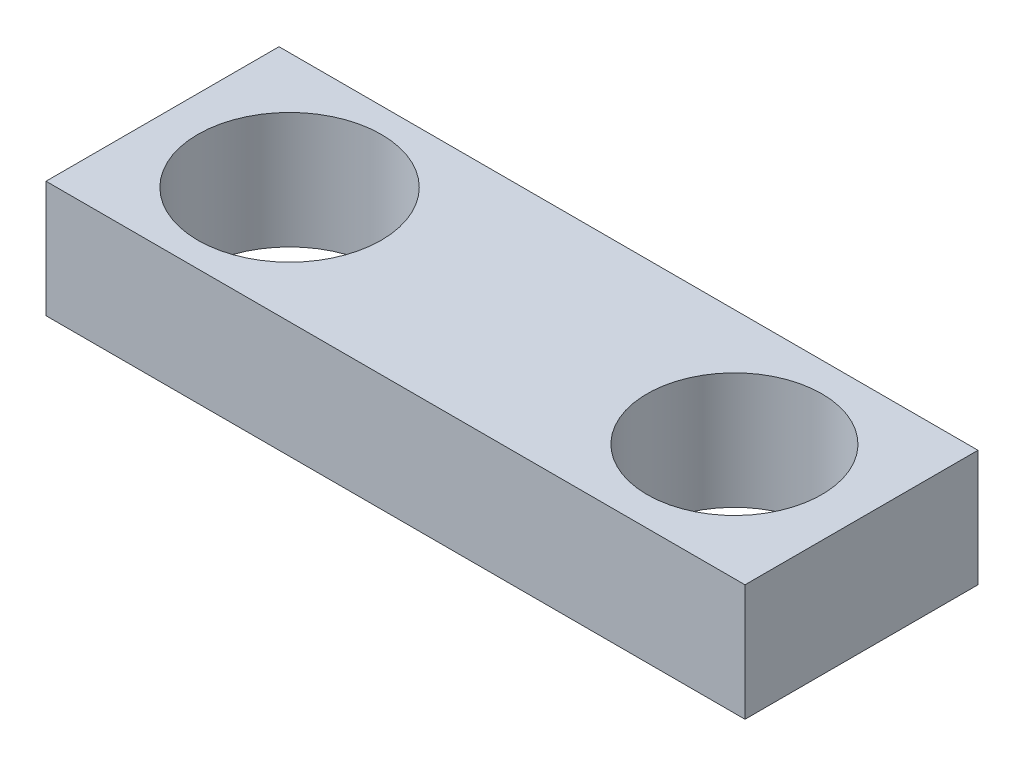
ISO-10303-21;
HEADER;
FILE_DESCRIPTION(('STEP AP214'),'2;1');
FILE_NAME('part.step','',(''),(''),'','','');
FILE_SCHEMA(('AUTOMOTIVE_DESIGN { 1 0 10303 214 1 1 1 1 }'));
ENDSEC;
DATA;
#1=APPLICATION_CONTEXT('core data for automotive mechanical design processes');
#2=APPLICATION_PROTOCOL_DEFINITION('international standard','automotive_design',2000,#1);
#3=PRODUCT_CONTEXT('',#1,'mechanical');
#4=PRODUCT('Part','Part','',(#3));
#5=PRODUCT_RELATED_PRODUCT_CATEGORY('part','',(#4));
#6=PRODUCT_DEFINITION_FORMATION('','',#4);
#7=PRODUCT_DEFINITION_CONTEXT('part definition',#1,'design');
#8=PRODUCT_DEFINITION('design','',#6,#7);
#9=PRODUCT_DEFINITION_SHAPE('','',#8);
#10=(LENGTH_UNIT() NAMED_UNIT(*) SI_UNIT(.MILLI.,.METRE.));
#11=(NAMED_UNIT(*) PLANE_ANGLE_UNIT() SI_UNIT($,.RADIAN.));
#12=(NAMED_UNIT(*) SI_UNIT($,.STERADIAN.) SOLID_ANGLE_UNIT());
#13=UNCERTAINTY_MEASURE_WITH_UNIT(LENGTH_MEASURE(1.E-05),#10,'distance_accuracy_value','');
#14=(GEOMETRIC_REPRESENTATION_CONTEXT(3) GLOBAL_UNCERTAINTY_ASSIGNED_CONTEXT((#13)) GLOBAL_UNIT_ASSIGNED_CONTEXT((#10,
#11,#12)) REPRESENTATION_CONTEXT('',''));
#15=CARTESIAN_POINT('',(0.,0.,0.));
#16=DIRECTION('',(0.,0.,1.));
#17=DIRECTION('',(1.,0.,0.));
#18=AXIS2_PLACEMENT_3D('',#15,#16,#17);
#19=CARTESIAN_POINT('',(0.,6.35,0.));
#20=DIRECTION('',(0.,-1.,0.));
#21=DIRECTION('',(0.,0.,-1.));
#22=AXIS2_PLACEMENT_3D('',#19,#20,#21);
#23=PLANE('',#22);
#24=DIRECTION('',(0.,0.,-1.));
#25=VECTOR('',#24,1.);
#26=CARTESIAN_POINT('',(19.05,6.35,6.35));
#27=LINE('',#26,#25);
#28=CARTESIAN_POINT('',(19.05,6.35,6.35));
#29=VERTEX_POINT('',#28);
#30=CARTESIAN_POINT('',(19.05,6.35,-6.35));
#31=VERTEX_POINT('',#30);
#32=EDGE_CURVE('E92',#29,#31,#27,.T.);
#33=ORIENTED_EDGE('',*,*,#32,.T.);
#34=DIRECTION('',(-1.,0.,0.));
#35=VECTOR('',#34,1.);
#36=CARTESIAN_POINT('',(-19.05,6.35,-6.35));
#37=LINE('',#36,#35);
#38=CARTESIAN_POINT('',(-19.05,6.35,-6.35));
#39=VERTEX_POINT('',#38);
#40=EDGE_CURVE('E87',#31,#39,#37,.T.);
#41=ORIENTED_EDGE('',*,*,#40,.T.);
#42=DIRECTION('',(0.,0.,1.));
#43=VECTOR('',#42,1.);
#44=CARTESIAN_POINT('',(-19.05,6.35,6.35));
#45=LINE('',#44,#43);
#46=CARTESIAN_POINT('',(-19.05,6.35,6.35));
#47=VERTEX_POINT('',#46);
#48=EDGE_CURVE('E90',#39,#47,#45,.T.);
#49=ORIENTED_EDGE('',*,*,#48,.T.);
#50=DIRECTION('',(1.,0.,0.));
#51=VECTOR('',#50,1.);
#52=CARTESIAN_POINT('',(-19.05,6.35,6.35));
#53=LINE('',#52,#51);
#54=EDGE_CURVE('E57',#47,#29,#53,.T.);
#55=ORIENTED_EDGE('',*,*,#54,.T.);
#56=EDGE_LOOP('',(#33,#41,#49,#55));
#57=FACE_BOUND('',#56,.T.);
#58=CARTESIAN_POINT('',(-12.12469,6.35,0.));
#59=DIRECTION('',(0.,1.,0.));
#60=DIRECTION('',(0.,0.,1.));
#61=AXIS2_PLACEMENT_3D('',#58,#59,#60);
#62=CIRCLE('',#61,5.);
#63=CARTESIAN_POINT('',(-12.12469,6.35,5.));
#64=VERTEX_POINT('',#63);
#65=EDGE_CURVE('E112',#64,#64,#62,.T.);
#66=ORIENTED_EDGE('',*,*,#65,.F.);
#67=EDGE_LOOP('',(#66));
#68=FACE_BOUND('',#67,.T.);
#69=CARTESIAN_POINT('',(12.12469,6.35,0.));
#70=DIRECTION('',(0.,1.,0.));
#71=DIRECTION('',(0.,0.,1.));
#72=AXIS2_PLACEMENT_3D('',#69,#70,#71);
#73=CIRCLE('',#72,4.7625);
#74=CARTESIAN_POINT('',(12.12469,6.35,4.7625));
#75=VERTEX_POINT('',#74);
#76=EDGE_CURVE('E134',#75,#75,#73,.T.);
#77=ORIENTED_EDGE('',*,*,#76,.F.);
#78=EDGE_LOOP('',(#77));
#79=FACE_BOUND('',#78,.T.);
#80=ADVANCED_FACE('F39',(#57,#68,#79),#23,.F.);
#81=CARTESIAN_POINT('',(0.,0.,0.));
#82=DIRECTION('',(0.,-1.,0.));
#83=DIRECTION('',(0.,0.,-1.));
#84=AXIS2_PLACEMENT_3D('',#81,#82,#83);
#85=PLANE('',#84);
#86=CARTESIAN_POINT('',(-12.12469,0.,0.));
#87=DIRECTION('',(0.,1.,0.));
#88=DIRECTION('',(0.,0.,1.));
#89=AXIS2_PLACEMENT_3D('',#86,#87,#88);
#90=CIRCLE('',#89,5.);
#91=CARTESIAN_POINT('',(-12.12469,0.,5.));
#92=VERTEX_POINT('',#91);
#93=EDGE_CURVE('E130',#92,#92,#90,.T.);
#94=ORIENTED_EDGE('',*,*,#93,.T.);
#95=EDGE_LOOP('',(#94));
#96=FACE_BOUND('',#95,.T.);
#97=DIRECTION('',(0.,0.,-1.));
#98=VECTOR('',#97,1.);
#99=CARTESIAN_POINT('',(19.05,0.,6.35));
#100=LINE('',#99,#98);
#101=CARTESIAN_POINT('',(19.05,0.,6.35));
#102=VERTEX_POINT('',#101);
#103=CARTESIAN_POINT('',(19.05,0.,-6.35));
#104=VERTEX_POINT('',#103);
#105=EDGE_CURVE('E108',#102,#104,#100,.T.);
#106=ORIENTED_EDGE('',*,*,#105,.F.);
#107=DIRECTION('',(1.,0.,0.));
#108=VECTOR('',#107,1.);
#109=CARTESIAN_POINT('',(-19.05,0.,6.35));
#110=LINE('',#109,#108);
#111=CARTESIAN_POINT('',(-19.05,0.,6.35));
#112=VERTEX_POINT('',#111);
#113=EDGE_CURVE('E80',#112,#102,#110,.T.);
#114=ORIENTED_EDGE('',*,*,#113,.F.);
#115=DIRECTION('',(0.,0.,1.));
#116=VECTOR('',#115,1.);
#117=CARTESIAN_POINT('',(-19.05,0.,6.35));
#118=LINE('',#117,#116);
#119=CARTESIAN_POINT('',(-19.05,0.,-6.35));
#120=VERTEX_POINT('',#119);
#121=EDGE_CURVE('E74',#120,#112,#118,.T.);
#122=ORIENTED_EDGE('',*,*,#121,.F.);
#123=DIRECTION('',(-1.,0.,0.));
#124=VECTOR('',#123,1.);
#125=CARTESIAN_POINT('',(-19.05,0.,-6.35));
#126=LINE('',#125,#124);
#127=EDGE_CURVE('E97',#104,#120,#126,.T.);
#128=ORIENTED_EDGE('',*,*,#127,.F.);
#129=EDGE_LOOP('',(#106,#114,#122,#128));
#130=FACE_BOUND('',#129,.T.);
#131=CARTESIAN_POINT('',(12.12469,0.,0.));
#132=DIRECTION('',(0.,1.,0.));
#133=DIRECTION('',(0.,0.,1.));
#134=AXIS2_PLACEMENT_3D('',#131,#132,#133);
#135=CIRCLE('',#134,4.7625);
#136=CARTESIAN_POINT('',(12.12469,0.,4.7625));
#137=VERTEX_POINT('',#136);
#138=EDGE_CURVE('E138',#137,#137,#135,.T.);
#139=ORIENTED_EDGE('',*,*,#138,.T.);
#140=EDGE_LOOP('',(#139));
#141=FACE_BOUND('',#140,.T.);
#142=ADVANCED_FACE('F125',(#96,#130,#141),#85,.T.);
#143=CARTESIAN_POINT('',(19.05,6.35,6.35));
#144=DIRECTION('',(-1.,0.,0.));
#145=DIRECTION('',(0.,0.,1.));
#146=AXIS2_PLACEMENT_3D('',#143,#144,#145);
#147=PLANE('',#146);
#148=ORIENTED_EDGE('',*,*,#105,.T.);
#149=DIRECTION('',(0.,-1.,0.));
#150=VECTOR('',#149,1.);
#151=CARTESIAN_POINT('',(19.05,6.35,-6.35));
#152=LINE('',#151,#150);
#153=EDGE_CURVE('E11',#31,#104,#152,.T.);
#154=ORIENTED_EDGE('',*,*,#153,.F.);
#155=ORIENTED_EDGE('',*,*,#32,.F.);
#156=DIRECTION('',(0.,-1.,0.));
#157=VECTOR('',#156,1.);
#158=CARTESIAN_POINT('',(19.05,6.35,6.35));
#159=LINE('',#158,#157);
#160=EDGE_CURVE('E104',#29,#102,#159,.T.);
#161=ORIENTED_EDGE('',*,*,#160,.T.);
#162=EDGE_LOOP('',(#148,#154,#155,#161));
#163=FACE_BOUND('',#162,.T.);
#164=ADVANCED_FACE('F41',(#163),#147,.F.);
#165=CARTESIAN_POINT('',(-19.05,6.35,-6.35));
#166=DIRECTION('',(0.,0.,1.));
#167=DIRECTION('',(1.,0.,0.));
#168=AXIS2_PLACEMENT_3D('',#165,#166,#167);
#169=PLANE('',#168);
#170=ORIENTED_EDGE('',*,*,#127,.T.);
#171=DIRECTION('',(0.,-1.,0.));
#172=VECTOR('',#171,1.);
#173=CARTESIAN_POINT('',(-19.05,6.35,-6.35));
#174=LINE('',#173,#172);
#175=EDGE_CURVE('E49',#39,#120,#174,.T.);
#176=ORIENTED_EDGE('',*,*,#175,.F.);
#177=ORIENTED_EDGE('',*,*,#40,.F.);
#178=ORIENTED_EDGE('',*,*,#153,.T.);
#179=EDGE_LOOP('',(#170,#176,#177,#178));
#180=FACE_BOUND('',#179,.T.);
#181=ADVANCED_FACE('F96',(#180),#169,.F.);
#182=CARTESIAN_POINT('',(-19.05,6.35,6.35));
#183=DIRECTION('',(1.,0.,0.));
#184=DIRECTION('',(0.,0.,-1.));
#185=AXIS2_PLACEMENT_3D('',#182,#183,#184);
#186=PLANE('',#185);
#187=ORIENTED_EDGE('',*,*,#121,.T.);
#188=DIRECTION('',(0.,-1.,0.));
#189=VECTOR('',#188,1.);
#190=CARTESIAN_POINT('',(-19.05,6.35,6.35));
#191=LINE('',#190,#189);
#192=EDGE_CURVE('E99',#47,#112,#191,.T.);
#193=ORIENTED_EDGE('',*,*,#192,.F.);
#194=ORIENTED_EDGE('',*,*,#48,.F.);
#195=ORIENTED_EDGE('',*,*,#175,.T.);
#196=EDGE_LOOP('',(#187,#193,#194,#195));
#197=FACE_BOUND('',#196,.T.);
#198=ADVANCED_FACE('F100',(#197),#186,.F.);
#199=CARTESIAN_POINT('',(-19.05,6.35,6.35));
#200=DIRECTION('',(0.,0.,-1.));
#201=DIRECTION('',(-1.,0.,0.));
#202=AXIS2_PLACEMENT_3D('',#199,#200,#201);
#203=PLANE('',#202);
#204=ORIENTED_EDGE('',*,*,#113,.T.);
#205=ORIENTED_EDGE('',*,*,#160,.F.);
#206=ORIENTED_EDGE('',*,*,#54,.F.);
#207=ORIENTED_EDGE('',*,*,#192,.T.);
#208=EDGE_LOOP('',(#204,#205,#206,#207));
#209=FACE_BOUND('',#208,.T.);
#210=ADVANCED_FACE('F122',(#209),#203,.F.);
#211=CARTESIAN_POINT('',(-12.12469,6.35,0.));
#212=DIRECTION('',(0.,-1.,0.));
#213=DIRECTION('',(0.,0.,-1.));
#214=AXIS2_PLACEMENT_3D('',#211,#212,#213);
#215=CYLINDRICAL_SURFACE('',#214,5.);
#216=ORIENTED_EDGE('',*,*,#65,.T.);
#217=EDGE_LOOP('',(#216));
#218=FACE_BOUND('',#217,.T.);
#219=ORIENTED_EDGE('',*,*,#93,.F.);
#220=EDGE_LOOP('',(#219));
#221=FACE_BOUND('',#220,.T.);
#222=ADVANCED_FACE('F157',(#218,#221),#215,.F.);
#223=CARTESIAN_POINT('',(12.12469,6.35,0.));
#224=DIRECTION('',(0.,-1.,0.));
#225=DIRECTION('',(0.,0.,-1.));
#226=AXIS2_PLACEMENT_3D('',#223,#224,#225);
#227=CYLINDRICAL_SURFACE('',#226,4.7625);
#228=ORIENTED_EDGE('',*,*,#76,.T.);
#229=EDGE_LOOP('',(#228));
#230=FACE_BOUND('',#229,.T.);
#231=ORIENTED_EDGE('',*,*,#138,.F.);
#232=EDGE_LOOP('',(#231));
#233=FACE_BOUND('',#232,.T.);
#234=ADVANCED_FACE('F146',(#230,#233),#227,.F.);
#235=CLOSED_SHELL('',(#80,#142,#164,#181,#198,#210,#222,#234));
#236=MANIFOLD_SOLID_BREP('B2',#235);
#237=ADVANCED_BREP_SHAPE_REPRESENTATION('',(#18,#236),#14);
#238=SHAPE_DEFINITION_REPRESENTATION(#9,#237);
ENDSEC;
END-ISO-10303-21;
